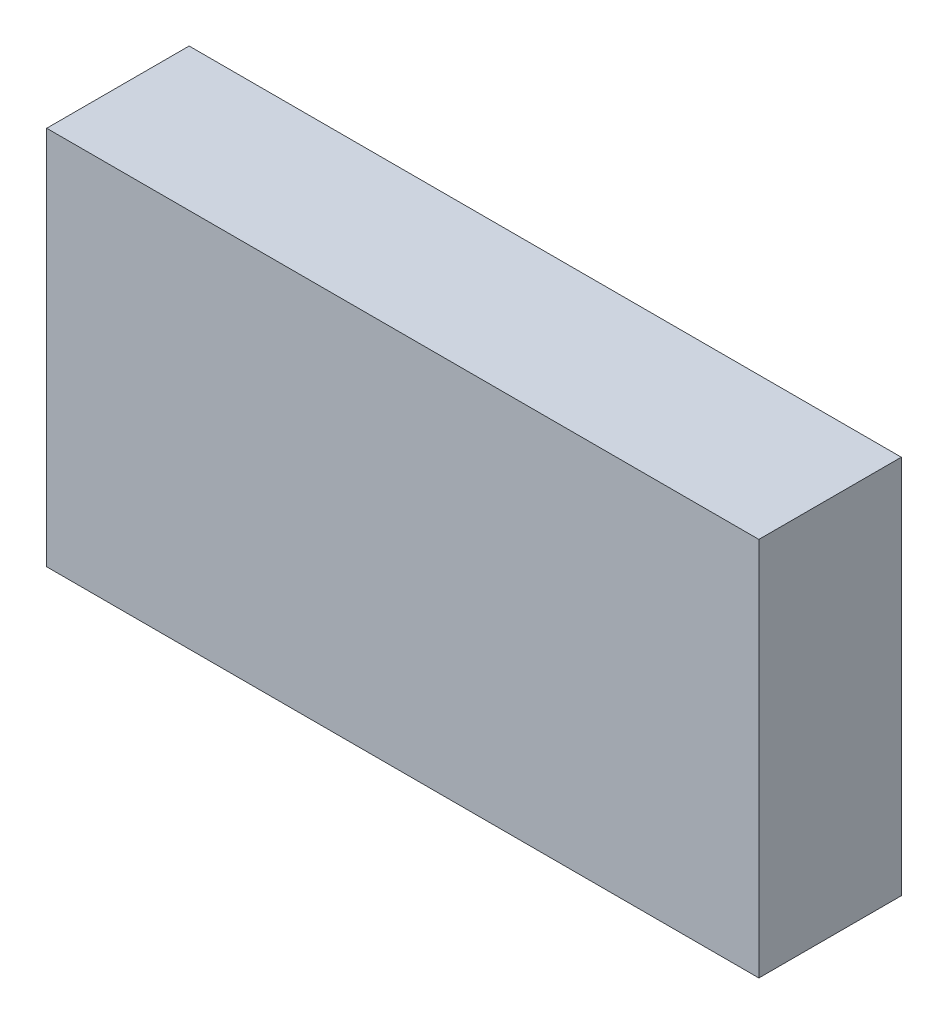
ISO-10303-21;
HEADER;
FILE_DESCRIPTION(('STEP AP214'),'2;1');
FILE_NAME('part.step','',(''),(''),'','','');
FILE_SCHEMA(('AUTOMOTIVE_DESIGN { 1 0 10303 214 1 1 1 1 }'));
ENDSEC;
DATA;
#1=APPLICATION_CONTEXT('core data for automotive mechanical design processes');
#2=APPLICATION_PROTOCOL_DEFINITION('international standard','automotive_design',2000,#1);
#3=PRODUCT_CONTEXT('',#1,'mechanical');
#4=PRODUCT('Part','Part','',(#3));
#5=PRODUCT_RELATED_PRODUCT_CATEGORY('part','',(#4));
#6=PRODUCT_DEFINITION_FORMATION('','',#4);
#7=PRODUCT_DEFINITION_CONTEXT('part definition',#1,'design');
#8=PRODUCT_DEFINITION('design','',#6,#7);
#9=PRODUCT_DEFINITION_SHAPE('','',#8);
#10=(LENGTH_UNIT() NAMED_UNIT(*) SI_UNIT(.MILLI.,.METRE.));
#11=(NAMED_UNIT(*) PLANE_ANGLE_UNIT() SI_UNIT($,.RADIAN.));
#12=(NAMED_UNIT(*) SI_UNIT($,.STERADIAN.) SOLID_ANGLE_UNIT());
#13=UNCERTAINTY_MEASURE_WITH_UNIT(LENGTH_MEASURE(1.E-05),#10,'distance_accuracy_value','');
#14=(GEOMETRIC_REPRESENTATION_CONTEXT(3) GLOBAL_UNCERTAINTY_ASSIGNED_CONTEXT((#13)) GLOBAL_UNIT_ASSIGNED_CONTEXT((#10,
#11,#12)) REPRESENTATION_CONTEXT('',''));
#15=CARTESIAN_POINT('',(0.,0.,0.));
#16=DIRECTION('',(0.,0.,1.));
#17=DIRECTION('',(1.,0.,0.));
#18=AXIS2_PLACEMENT_3D('',#15,#16,#17);
#19=CARTESIAN_POINT('',(596.,98.,-3.));
#20=DIRECTION('',(-1.,0.,0.));
#21=DIRECTION('',(0.,0.,1.));
#22=AXIS2_PLACEMENT_3D('',#19,#20,#21);
#23=PLANE('',#22);
#24=DIRECTION('',(0.,-1.,0.));
#25=VECTOR('',#24,1.);
#26=CARTESIAN_POINT('',(596.,98.,0.));
#27=LINE('',#26,#25);
#28=CARTESIAN_POINT('',(596.,106.,0.));
#29=VERTEX_POINT('',#28);
#30=CARTESIAN_POINT('',(596.,98.,0.));
#31=VERTEX_POINT('',#30);
#32=EDGE_CURVE('E103',#29,#31,#27,.T.);
#33=ORIENTED_EDGE('',*,*,#32,.F.);
#34=DIRECTION('',(0.,0.,1.));
#35=VECTOR('',#34,1.);
#36=CARTESIAN_POINT('',(596.,106.,-3.));
#37=LINE('',#36,#35);
#38=CARTESIAN_POINT('',(596.,106.,-3.));
#39=VERTEX_POINT('',#38);
#40=EDGE_CURVE('E11',#39,#29,#37,.T.);
#41=ORIENTED_EDGE('',*,*,#40,.F.);
#42=DIRECTION('',(0.,-1.,0.));
#43=VECTOR('',#42,1.);
#44=CARTESIAN_POINT('',(596.,98.,-3.));
#45=LINE('',#44,#43);
#46=CARTESIAN_POINT('',(596.,98.,-3.));
#47=VERTEX_POINT('',#46);
#48=EDGE_CURVE('E97',#39,#47,#45,.T.);
#49=ORIENTED_EDGE('',*,*,#48,.T.);
#50=DIRECTION('',(0.,0.,1.));
#51=VECTOR('',#50,1.);
#52=CARTESIAN_POINT('',(596.,98.,-3.));
#53=LINE('',#52,#51);
#54=EDGE_CURVE('E42',#47,#31,#53,.T.);
#55=ORIENTED_EDGE('',*,*,#54,.T.);
#56=EDGE_LOOP('',(#33,#41,#49,#55));
#57=FACE_BOUND('',#56,.T.);
#58=ADVANCED_FACE('F39',(#57),#23,.T.);
#59=CARTESIAN_POINT('',(596.,106.,-3.));
#60=DIRECTION('',(0.,1.,0.));
#61=DIRECTION('',(0.,0.,1.));
#62=AXIS2_PLACEMENT_3D('',#59,#60,#61);
#63=PLANE('',#62);
#64=DIRECTION('',(-1.,0.,0.));
#65=VECTOR('',#64,1.);
#66=CARTESIAN_POINT('',(596.,106.,0.));
#67=LINE('',#66,#65);
#68=CARTESIAN_POINT('',(611.,106.,0.));
#69=VERTEX_POINT('',#68);
#70=EDGE_CURVE('E99',#69,#29,#67,.T.);
#71=ORIENTED_EDGE('',*,*,#70,.F.);
#72=DIRECTION('',(0.,0.,1.));
#73=VECTOR('',#72,1.);
#74=CARTESIAN_POINT('',(611.,106.,-3.));
#75=LINE('',#74,#73);
#76=CARTESIAN_POINT('',(611.,106.,-3.));
#77=VERTEX_POINT('',#76);
#78=EDGE_CURVE('E48',#77,#69,#75,.T.);
#79=ORIENTED_EDGE('',*,*,#78,.F.);
#80=DIRECTION('',(-1.,0.,0.));
#81=VECTOR('',#80,1.);
#82=CARTESIAN_POINT('',(596.,106.,-3.));
#83=LINE('',#82,#81);
#84=EDGE_CURVE('E94',#77,#39,#83,.T.);
#85=ORIENTED_EDGE('',*,*,#84,.T.);
#86=ORIENTED_EDGE('',*,*,#40,.T.);
#87=EDGE_LOOP('',(#71,#79,#85,#86));
#88=FACE_BOUND('',#87,.T.);
#89=ADVANCED_FACE('F113',(#88),#63,.T.);
#90=CARTESIAN_POINT('',(611.,98.,-3.));
#91=DIRECTION('',(1.,0.,0.));
#92=DIRECTION('',(0.,0.,-1.));
#93=AXIS2_PLACEMENT_3D('',#90,#91,#92);
#94=PLANE('',#93);
#95=DIRECTION('',(0.,1.,0.));
#96=VECTOR('',#95,1.);
#97=CARTESIAN_POINT('',(611.,98.,0.));
#98=LINE('',#97,#96);
#99=CARTESIAN_POINT('',(611.,98.,0.));
#100=VERTEX_POINT('',#99);
#101=EDGE_CURVE('E89',#100,#69,#98,.T.);
#102=ORIENTED_EDGE('',*,*,#101,.F.);
#103=DIRECTION('',(0.,0.,1.));
#104=VECTOR('',#103,1.);
#105=CARTESIAN_POINT('',(611.,98.,-3.));
#106=LINE('',#105,#104);
#107=CARTESIAN_POINT('',(611.,98.,-3.));
#108=VERTEX_POINT('',#107);
#109=EDGE_CURVE('E84',#108,#100,#106,.T.);
#110=ORIENTED_EDGE('',*,*,#109,.F.);
#111=DIRECTION('',(0.,1.,0.));
#112=VECTOR('',#111,1.);
#113=CARTESIAN_POINT('',(611.,98.,-3.));
#114=LINE('',#113,#112);
#115=EDGE_CURVE('E87',#108,#77,#114,.T.);
#116=ORIENTED_EDGE('',*,*,#115,.T.);
#117=ORIENTED_EDGE('',*,*,#78,.T.);
#118=EDGE_LOOP('',(#102,#110,#116,#117));
#119=FACE_BOUND('',#118,.T.);
#120=ADVANCED_FACE('F86',(#119),#94,.T.);
#121=CARTESIAN_POINT('',(596.,98.,-3.));
#122=DIRECTION('',(0.,-1.,0.));
#123=DIRECTION('',(0.,0.,-1.));
#124=AXIS2_PLACEMENT_3D('',#121,#122,#123);
#125=PLANE('',#124);
#126=DIRECTION('',(1.,0.,0.));
#127=VECTOR('',#126,1.);
#128=CARTESIAN_POINT('',(596.,98.,0.));
#129=LINE('',#128,#127);
#130=EDGE_CURVE('E106',#31,#100,#129,.T.);
#131=ORIENTED_EDGE('',*,*,#130,.F.);
#132=ORIENTED_EDGE('',*,*,#54,.F.);
#133=DIRECTION('',(1.,0.,0.));
#134=VECTOR('',#133,1.);
#135=CARTESIAN_POINT('',(596.,98.,-3.));
#136=LINE('',#135,#134);
#137=EDGE_CURVE('E93',#47,#108,#136,.T.);
#138=ORIENTED_EDGE('',*,*,#137,.T.);
#139=ORIENTED_EDGE('',*,*,#109,.T.);
#140=EDGE_LOOP('',(#131,#132,#138,#139));
#141=FACE_BOUND('',#140,.T.);
#142=ADVANCED_FACE('F96',(#141),#125,.T.);
#143=CARTESIAN_POINT('',(0.,0.,-3.));
#144=DIRECTION('',(0.,0.,-1.));
#145=DIRECTION('',(-1.,0.,0.));
#146=AXIS2_PLACEMENT_3D('',#143,#144,#145);
#147=PLANE('',#146);
#148=ORIENTED_EDGE('',*,*,#48,.F.);
#149=ORIENTED_EDGE('',*,*,#84,.F.);
#150=ORIENTED_EDGE('',*,*,#115,.F.);
#151=ORIENTED_EDGE('',*,*,#137,.F.);
#152=EDGE_LOOP('',(#148,#149,#150,#151));
#153=FACE_BOUND('',#152,.T.);
#154=ADVANCED_FACE('F92',(#153),#147,.T.);
#155=CARTESIAN_POINT('',(0.,0.,0.));
#156=DIRECTION('',(0.,0.,-1.));
#157=DIRECTION('',(-1.,0.,0.));
#158=AXIS2_PLACEMENT_3D('',#155,#156,#157);
#159=PLANE('',#158);
#160=ORIENTED_EDGE('',*,*,#32,.T.);
#161=ORIENTED_EDGE('',*,*,#130,.T.);
#162=ORIENTED_EDGE('',*,*,#101,.T.);
#163=ORIENTED_EDGE('',*,*,#70,.T.);
#164=EDGE_LOOP('',(#160,#161,#162,#163));
#165=FACE_BOUND('',#164,.T.);
#166=ADVANCED_FACE('F112',(#165),#159,.F.);
#167=CLOSED_SHELL('',(#58,#89,#120,#142,#154,#166));
#168=MANIFOLD_SOLID_BREP('B2',#167);
#169=ADVANCED_BREP_SHAPE_REPRESENTATION('',(#18,#168),#14);
#170=SHAPE_DEFINITION_REPRESENTATION(#9,#169);
ENDSEC;
END-ISO-10303-21;
